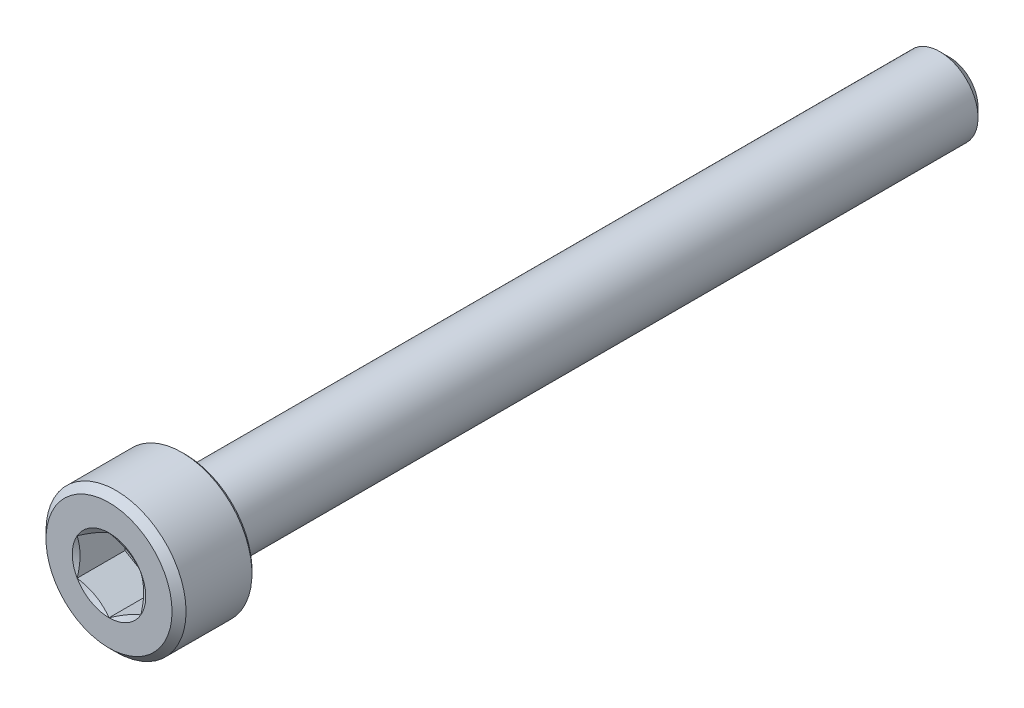
ISO-10303-21;
HEADER;
FILE_DESCRIPTION(('STEP AP214'),'2;1');
FILE_NAME('part.step','',(''),(''),'','','');
FILE_SCHEMA(('AUTOMOTIVE_DESIGN { 1 0 10303 214 1 1 1 1 }'));
ENDSEC;
DATA;
#1=APPLICATION_CONTEXT('core data for automotive mechanical design processes');
#2=APPLICATION_PROTOCOL_DEFINITION('international standard','automotive_design',2000,#1);
#3=PRODUCT_CONTEXT('',#1,'mechanical');
#4=PRODUCT('Part','Part','',(#3));
#5=PRODUCT_RELATED_PRODUCT_CATEGORY('part','',(#4));
#6=PRODUCT_DEFINITION_FORMATION('','',#4);
#7=PRODUCT_DEFINITION_CONTEXT('part definition',#1,'design');
#8=PRODUCT_DEFINITION('design','',#6,#7);
#9=PRODUCT_DEFINITION_SHAPE('','',#8);
#10=(LENGTH_UNIT() NAMED_UNIT(*) SI_UNIT(.MILLI.,.METRE.));
#11=(NAMED_UNIT(*) PLANE_ANGLE_UNIT() SI_UNIT($,.RADIAN.));
#12=(NAMED_UNIT(*) SI_UNIT($,.STERADIAN.) SOLID_ANGLE_UNIT());
#13=UNCERTAINTY_MEASURE_WITH_UNIT(LENGTH_MEASURE(1.E-05),#10,'distance_accuracy_value','');
#14=(GEOMETRIC_REPRESENTATION_CONTEXT(3) GLOBAL_UNCERTAINTY_ASSIGNED_CONTEXT((#13)) GLOBAL_UNIT_ASSIGNED_CONTEXT((#10,
#11,#12)) REPRESENTATION_CONTEXT('',''));
#15=CARTESIAN_POINT('',(0.,0.,0.));
#16=DIRECTION('',(0.,0.,1.));
#17=DIRECTION('',(1.,0.,0.));
#18=AXIS2_PLACEMENT_3D('',#15,#16,#17);
#19=CARTESIAN_POINT('',(-2.6125,0.,13.5));
#20=DIRECTION('',(0.,0.,-1.));
#21=DIRECTION('',(-1.,0.,0.));
#22=AXIS2_PLACEMENT_3D('',#19,#20,#21);
#23=PLANE('',#22);
#24=CARTESIAN_POINT('',(0.,0.,13.5));
#25=DIRECTION('',(0.,0.,-1.));
#26=DIRECTION('',(-1.,0.,0.));
#27=AXIS2_PLACEMENT_3D('',#24,#25,#26);
#28=CIRCLE('',#27,1.5);
#29=CARTESIAN_POINT('',(-1.5,0.,13.5));
#30=VERTEX_POINT('',#29);
#31=EDGE_CURVE('E12',#30,#30,#28,.T.);
#32=ORIENTED_EDGE('',*,*,#31,.F.);
#33=EDGE_LOOP('',(#32));
#34=FACE_BOUND('',#33,.T.);
#35=CARTESIAN_POINT('',(0.,0.,13.5));
#36=DIRECTION('',(0.,0.,-1.));
#37=DIRECTION('',(-1.,0.,0.));
#38=AXIS2_PLACEMENT_3D('',#35,#36,#37);
#39=CIRCLE('',#38,2.6125);
#40=CARTESIAN_POINT('',(-2.6125,0.,13.5));
#41=VERTEX_POINT('',#40);
#42=EDGE_CURVE('E260',#41,#41,#39,.T.);
#43=ORIENTED_EDGE('',*,*,#42,.T.);
#44=EDGE_LOOP('',(#43));
#45=FACE_BOUND('',#44,.T.);
#46=ADVANCED_FACE('F42',(#34,#45),#23,.T.);
#47=CARTESIAN_POINT('',(0.,0.,14.625));
#48=DIRECTION('',(0.,0.,1.));
#49=DIRECTION('',(1.,0.,0.));
#50=AXIS2_PLACEMENT_3D('',#47,#48,#49);
#51=PLANE('',#50);
#52=DIRECTION('',(-0.866025403784439,0.5,0.));
#53=VECTOR('',#52,1.);
#54=CARTESIAN_POINT('',(1.25,0.721687836487031,14.625));
#55=LINE('',#54,#53);
#56=CARTESIAN_POINT('',(1.25,0.721687836487031,14.625));
#57=VERTEX_POINT('',#56);
#58=CARTESIAN_POINT('',(0.,1.44337567297406,14.625));
#59=VERTEX_POINT('',#58);
#60=EDGE_CURVE('E108',#57,#59,#55,.T.);
#61=ORIENTED_EDGE('',*,*,#60,.T.);
#62=DIRECTION('',(-0.866025403784438,-0.5,0.));
#63=VECTOR('',#62,1.);
#64=CARTESIAN_POINT('',(0.,1.44337567297406,14.625));
#65=LINE('',#64,#63);
#66=CARTESIAN_POINT('',(-1.25,0.72168783648703,14.625));
#67=VERTEX_POINT('',#66);
#68=EDGE_CURVE('E227',#59,#67,#65,.T.);
#69=ORIENTED_EDGE('',*,*,#68,.T.);
#70=DIRECTION('',(0.,-1.,0.));
#71=VECTOR('',#70,1.);
#72=CARTESIAN_POINT('',(-1.25,0.72168783648703,14.625));
#73=LINE('',#72,#71);
#74=CARTESIAN_POINT('',(-1.25,-0.721687836487034,14.625));
#75=VERTEX_POINT('',#74);
#76=EDGE_CURVE('E230',#67,#75,#73,.T.);
#77=ORIENTED_EDGE('',*,*,#76,.T.);
#78=DIRECTION('',(0.866025403784439,-0.5,0.));
#79=VECTOR('',#78,1.);
#80=CARTESIAN_POINT('',(-1.25,-0.721687836487034,14.625));
#81=LINE('',#80,#79);
#82=CARTESIAN_POINT('',(0.,-1.44337567297407,14.625));
#83=VERTEX_POINT('',#82);
#84=EDGE_CURVE('E231',#75,#83,#81,.T.);
#85=ORIENTED_EDGE('',*,*,#84,.T.);
#86=DIRECTION('',(0.866025403784439,0.5,0.));
#87=VECTOR('',#86,1.);
#88=CARTESIAN_POINT('',(0.,-1.44337567297407,14.625));
#89=LINE('',#88,#87);
#90=CARTESIAN_POINT('',(1.25,-0.721687836487034,14.625));
#91=VERTEX_POINT('',#90);
#92=EDGE_CURVE('E236',#83,#91,#89,.T.);
#93=ORIENTED_EDGE('',*,*,#92,.T.);
#94=DIRECTION('',(0.,1.,0.));
#95=VECTOR('',#94,1.);
#96=CARTESIAN_POINT('',(1.25,-0.721687836487034,14.625));
#97=LINE('',#96,#95);
#98=EDGE_CURVE('E229',#91,#57,#97,.T.);
#99=ORIENTED_EDGE('',*,*,#98,.T.);
#100=EDGE_LOOP('',(#61,#69,#77,#85,#93,#99));
#101=FACE_BOUND('',#100,.T.);
#102=ADVANCED_FACE('F216',(#101),#51,.T.);
#103=CARTESIAN_POINT('',(0.,1.44337567297406,14.625));
#104=DIRECTION('',(-0.5,0.866025403784438,0.));
#105=DIRECTION('',(-0.866025403784439,-0.5,0.));
#106=AXIS2_PLACEMENT_3D('',#103,#104,#105);
#107=PLANE('',#106);
#108=DIRECTION('',(0.,0.,1.));
#109=VECTOR('',#108,1.);
#110=CARTESIAN_POINT('',(0.,1.44337567297406,14.625));
#111=LINE('',#110,#109);
#112=CARTESIAN_POINT('',(0.,1.44337567297406,16.5));
#113=VERTEX_POINT('',#112);
#114=EDGE_CURVE('E64',#59,#113,#111,.T.);
#115=ORIENTED_EDGE('',*,*,#114,.T.);
#116=CARTESIAN_POINT('',(0.000199999999999545,1.4434911430279,16.500066674666));
#117=CARTESIAN_POINT('',(-0.0547333052317655,1.41177538446486,16.4817459147637));
#118=CARTESIAN_POINT('',(-0.11014078650024,1.37978586023939,16.4650833062006));
#119=CARTESIAN_POINT('',(-0.22191536760034,1.31525277575269,16.4359973039458));
#120=CARTESIAN_POINT('',(-0.278284454841711,1.28270806805991,16.4235842019761));
#121=CARTESIAN_POINT('',(-0.390323974086985,1.21802202146378,16.404259687636));
#122=CARTESIAN_POINT('',(-0.44597715845923,1.1858906404852,16.3972196894474));
#123=CARTESIAN_POINT('',(-0.557545653908392,1.12147653960455,16.3888124326306));
#124=CARTESIAN_POINT('',(-0.613460558937601,1.08919405413422,16.3874382152047));
#125=CARTESIAN_POINT('',(-0.717957921181725,1.02886247391297,16.3902833373679));
#126=CARTESIAN_POINT('',(-0.766555949881316,1.00080438896118,16.39380409882));
#127=CARTESIAN_POINT('',(-0.863435362173239,0.944871034195501,16.4049671126993));
#128=CARTESIAN_POINT('',(-0.911716410192164,0.916995958125017,16.4126131855727));
#129=CARTESIAN_POINT('',(-1.00879588385404,0.860947097873544,16.4317294547005));
#130=CARTESIAN_POINT('',(-1.0575820103519,0.832780414607287,16.4432807569797));
#131=CARTESIAN_POINT('',(-1.1544262522921,0.776867365453646,16.4694983146939));
#132=CARTESIAN_POINT('',(-1.20248561032696,0.749120282155138,16.4841584021391));
#133=CARTESIAN_POINT('',(-1.2502,0.721572366433192,16.500066674666));
#134=B_SPLINE_CURVE_WITH_KNOTS('',3,(#116,#117,#118,#119,#120,#121,#122,#123,#124,#125,#126,
#127,#128,#129,#130,#131,#132,#133),.UNSPECIFIED.,.F.,.F.,(4,2,2,2,2,2,2,2,4),(0.,
0.198150821029559,0.396778196315221,0.5904886173544,0.783961049317182,0.952480056398646,
1.1211553973001,1.2935743034359,1.4656542697693),.UNSPECIFIED.);
#135=CARTESIAN_POINT('',(-1.25,0.721687836487032,16.5));
#136=VERTEX_POINT('',#135);
#137=EDGE_CURVE('E121',#113,#136,#134,.T.);
#138=ORIENTED_EDGE('',*,*,#137,.T.);
#139=DIRECTION('',(0.,0.,1.));
#140=VECTOR('',#139,1.);
#141=CARTESIAN_POINT('',(-1.25,0.72168783648703,14.625));
#142=LINE('',#141,#140);
#143=EDGE_CURVE('E245',#67,#136,#142,.T.);
#144=ORIENTED_EDGE('',*,*,#143,.F.);
#145=ORIENTED_EDGE('',*,*,#68,.F.);
#146=EDGE_LOOP('',(#115,#138,#144,#145));
#147=FACE_BOUND('',#146,.T.);
#148=ADVANCED_FACE('F155',(#147),#107,.F.);
#149=CARTESIAN_POINT('',(-1.25,0.72168783648703,14.625));
#150=DIRECTION('',(-1.,0.,0.));
#151=DIRECTION('',(0.,-1.,0.));
#152=AXIS2_PLACEMENT_3D('',#149,#150,#151);
#153=PLANE('',#152);
#154=ORIENTED_EDGE('',*,*,#143,.T.);
#155=CARTESIAN_POINT('',(-1.25,-1.86893140179217,16.9647941109243));
#156=CARTESIAN_POINT('',(-1.25,-1.81495202267025,16.9388968384665));
#157=CARTESIAN_POINT('',(-1.25,-1.76084125344196,16.9132686219312));
#158=CARTESIAN_POINT('',(-1.25,-1.65228662652066,16.8627027606134));
#159=CARTESIAN_POINT('',(-1.25,-1.59784271100767,16.8377652401103));
#160=CARTESIAN_POINT('',(-1.25,-1.48823931692675,16.7885939163498));
#161=CARTESIAN_POINT('',(-1.25,-1.43307750108907,16.7643652994868));
#162=CARTESIAN_POINT('',(-1.25,-1.32229188443621,16.7169950705039));
#163=CARTESIAN_POINT('',(-1.25,-1.26666810781962,16.6938534018645));
#164=CARTESIAN_POINT('',(-1.25,-1.15340083047608,16.6483546130678));
#165=CARTESIAN_POINT('',(-1.25,-1.09574254265115,16.6260338154653));
#166=CARTESIAN_POINT('',(-1.25,-0.979741082890175,16.583255476912));
#167=CARTESIAN_POINT('',(-1.25,-0.921397826164638,16.5627981694397));
#168=CARTESIAN_POINT('',(-1.25,-0.745435524772241,16.5050842376762));
#169=CARTESIAN_POINT('',(-1.25,-0.62656193813286,16.4713502149769));
#170=CARTESIAN_POINT('',(-1.25,-0.445873083681239,16.4322204068282));
#171=CARTESIAN_POINT('',(-1.25,-0.385304700192768,16.4210940606189));
#172=CARTESIAN_POINT('',(-1.25,-0.26348659206503,16.4034278522676));
#173=CARTESIAN_POINT('',(-1.25,-0.202236913753247,16.3968876801832));
#174=CARTESIAN_POINT('',(-1.25,-0.0801324468775848,16.3889987810428));
#175=CARTESIAN_POINT('',(-1.25,-0.0192817197887167,16.3875887912582));
#176=CARTESIAN_POINT('',(-1.25,0.102319232701152,16.3899161878862));
#177=CARTESIAN_POINT('',(-1.25,0.163069451645859,16.393653893026));
#178=CARTESIAN_POINT('',(-1.25,0.312961598922923,16.4088980280361));
#179=CARTESIAN_POINT('',(-1.25,0.401813055628259,16.4232612484297));
#180=CARTESIAN_POINT('',(-1.25,0.577788146583197,16.4602998495149));
#181=CARTESIAN_POINT('',(-1.25,0.664909564430747,16.4829852483541));
#182=CARTESIAN_POINT('',(-1.25,0.795209224728791,16.5217374532821));
#183=CARTESIAN_POINT('',(-1.25,0.839061001813533,16.5356229448103));
#184=CARTESIAN_POINT('',(-1.25,0.926308087473953,16.5646784153621));
#185=CARTESIAN_POINT('',(-1.25,0.969703662172459,16.5798475927664));
#186=CARTESIAN_POINT('',(-1.25,1.05609633508794,16.6112501339966));
#187=CARTESIAN_POINT('',(-1.25,1.09909350410933,16.627483304423));
#188=CARTESIAN_POINT('',(-1.25,1.18474903910479,16.6608382439108));
#189=CARTESIAN_POINT('',(-1.25,1.22740734642399,16.6779601631043));
#190=CARTESIAN_POINT('',(-1.25,1.33629459550825,16.7227614292321));
#191=CARTESIAN_POINT('',(-1.25,1.40230581092028,16.7509693835735));
#192=CARTESIAN_POINT('',(-1.25,1.53373213594212,16.8087450811585));
#193=CARTESIAN_POINT('',(-1.25,1.59914720045374,16.8383129262699));
#194=CARTESIAN_POINT('',(-1.25,1.79469680395942,16.9285769200244));
#195=CARTESIAN_POINT('',(-1.25,1.92411390982368,16.9908242731852));
#196=CARTESIAN_POINT('',(-1.25,2.18184246876936,17.1179296229027));
#197=CARTESIAN_POINT('',(-1.25,2.31015236703661,17.182790734765));
#198=CARTESIAN_POINT('',(-1.25,2.56589305685455,17.3141807455314));
#199=CARTESIAN_POINT('',(-1.25,2.69332395754888,17.3807094324427));
#200=CARTESIAN_POINT('',(-1.25,2.93557826301822,17.5085820016458));
#201=CARTESIAN_POINT('',(-1.25,3.05045639113076,17.5698225704122));
#202=CARTESIAN_POINT('',(-1.25,3.27984311898855,17.6930014800409));
#203=CARTESIAN_POINT('',(-1.25,3.39435170485538,17.7549398467261));
#204=CARTESIAN_POINT('',(-1.25,3.62279327872168,17.8791811560561));
#205=CARTESIAN_POINT('',(-1.25,3.73672698995313,17.941482770676));
#206=CARTESIAN_POINT('',(-1.25,3.96436406629495,18.0664914919315));
#207=CARTESIAN_POINT('',(-1.25,4.07806744314788,18.1291985771761));
#208=CARTESIAN_POINT('',(-1.25,4.19168806612954,18.1920543493623));
#209=B_SPLINE_CURVE_WITH_KNOTS('',3,(#155,#156,#157,#158,#159,#160,#161,#162,#163,#164,#165,
#166,#167,#168,#169,#170,#171,#172,#173,#174,#175,#176,#177,#178,#179,#180,#181,#182,#183,#184,
#185,#186,#187,#188,#189,#190,#191,#192,#193,#194,#195,#196,#197,#198,#199,#200,#201,#202,#203,
#204,#205,#206,#207,#208),.UNSPECIFIED.,.F.,.F.,(4,2,2,2,2,2,2,2,2,2,2,2,2,2,2,2,2,2,2,2,2,2,2,
2,2,2,4),(0.,0.179612926712514,0.359257964580623,0.539992735616907,0.720718098311213,
0.906167781883877,1.09164066876278,1.4615401462125,1.64614554413147,1.83073846485712,
2.0131196740194,2.19551217609307,2.46497297688035,2.73475922178117,2.87273702323329,
3.01062928909397,3.14849655975686,3.28638719597089,3.50172172546908,3.7170724117864,
4.14784491349865,4.57914698286382,5.01039449766869,5.40093821140478,5.79149642546539,
6.18106124184771,6.57060567131893),.UNSPECIFIED.);
#210=CARTESIAN_POINT('',(-1.25,-0.721687836487033,16.5));
#211=VERTEX_POINT('',#210);
#212=EDGE_CURVE('E128',#136,#211,#209,.F.);
#213=ORIENTED_EDGE('',*,*,#212,.T.);
#214=DIRECTION('',(0.,0.,1.));
#215=VECTOR('',#214,1.);
#216=CARTESIAN_POINT('',(-1.25,-0.721687836487034,14.625));
#217=LINE('',#216,#215);
#218=EDGE_CURVE('E243',#75,#211,#217,.T.);
#219=ORIENTED_EDGE('',*,*,#218,.F.);
#220=ORIENTED_EDGE('',*,*,#76,.F.);
#221=EDGE_LOOP('',(#154,#213,#219,#220));
#222=FACE_BOUND('',#221,.T.);
#223=ADVANCED_FACE('F150',(#222),#153,.F.);
#224=CARTESIAN_POINT('',(-1.25,-0.721687836487034,14.625));
#225=DIRECTION('',(-0.5,-0.866025403784439,0.));
#226=DIRECTION('',(0.866025403784439,-0.5,0.));
#227=AXIS2_PLACEMENT_3D('',#224,#225,#226);
#228=PLANE('',#227);
#229=ORIENTED_EDGE('',*,*,#218,.T.);
#230=CARTESIAN_POINT('',(-1.2502,-0.721572366433196,16.500066674666));
#231=CARTESIAN_POINT('',(-1.19526669476823,-0.753288124996232,16.4817459147637));
#232=CARTESIAN_POINT('',(-1.13985921349976,-0.785277649221705,16.4650833062006));
#233=CARTESIAN_POINT('',(-1.02808463239966,-0.849810733708405,16.4359973039458));
#234=CARTESIAN_POINT('',(-0.971715545158289,-0.882355441401184,16.423584201976));
#235=CARTESIAN_POINT('',(-0.859676025913015,-0.947041487997319,16.404259687636));
#236=CARTESIAN_POINT('',(-0.80402284154077,-0.979172868975895,16.3972196894474));
#237=CARTESIAN_POINT('',(-0.692454346091608,-1.04358696985655,16.3888124326306));
#238=CARTESIAN_POINT('',(-0.636539441062399,-1.07586945532688,16.3874382152047));
#239=CARTESIAN_POINT('',(-0.532042078818274,-1.13620103554813,16.3902833373679));
#240=CARTESIAN_POINT('',(-0.483444050118683,-1.16425912049992,16.39380409882));
#241=CARTESIAN_POINT('',(-0.38656463782676,-1.2201924752656,16.4049671126993));
#242=CARTESIAN_POINT('',(-0.338283589807835,-1.24806755133608,16.4126131855727));
#243=CARTESIAN_POINT('',(-0.241204116145956,-1.30411641158755,16.4317294547005));
#244=CARTESIAN_POINT('',(-0.192417989648099,-1.33228309485381,16.4432807569797));
#245=CARTESIAN_POINT('',(-0.0955737477078969,-1.38819614400745,16.4694983146939));
#246=CARTESIAN_POINT('',(-0.0475143896730349,-1.41594322730596,16.4841584021391));
#247=CARTESIAN_POINT('',(0.000200000000000781,-1.4434911430279,16.500066674666));
#248=B_SPLINE_CURVE_WITH_KNOTS('',3,(#230,#231,#232,#233,#234,#235,#236,#237,#238,#239,#240,
#241,#242,#243,#244,#245,#246,#247),.UNSPECIFIED.,.F.,.F.,(4,2,2,2,2,2,2,2,4),(0.,
0.19815082102956,0.396778196315222,0.590488617354401,0.783961049317183,0.952480056398648,
1.1211553973001,1.2935743034359,1.4656542697693),.UNSPECIFIED.);
#249=CARTESIAN_POINT('',(0.,-1.44337567297407,16.5));
#250=VERTEX_POINT('',#249);
#251=EDGE_CURVE('E131',#211,#250,#248,.T.);
#252=ORIENTED_EDGE('',*,*,#251,.T.);
#253=DIRECTION('',(0.,0.,1.));
#254=VECTOR('',#253,1.);
#255=CARTESIAN_POINT('',(0.,-1.44337567297407,14.625));
#256=LINE('',#255,#254);
#257=EDGE_CURVE('E240',#83,#250,#256,.T.);
#258=ORIENTED_EDGE('',*,*,#257,.F.);
#259=ORIENTED_EDGE('',*,*,#84,.F.);
#260=EDGE_LOOP('',(#229,#252,#258,#259));
#261=FACE_BOUND('',#260,.T.);
#262=ADVANCED_FACE('F154',(#261),#228,.F.);
#263=CARTESIAN_POINT('',(0.,-1.44337567297407,14.625));
#264=DIRECTION('',(0.5,-0.866025403784439,0.));
#265=DIRECTION('',(0.866025403784439,0.5,0.));
#266=AXIS2_PLACEMENT_3D('',#263,#264,#265);
#267=PLANE('',#266);
#268=ORIENTED_EDGE('',*,*,#257,.T.);
#269=CARTESIAN_POINT('',(-0.000199999999999969,-1.4434911430279,16.500066674666));
#270=CARTESIAN_POINT('',(0.0547333052317653,-1.41177538446487,16.4817459147637));
#271=CARTESIAN_POINT('',(0.11014078650024,-1.3797858602394,16.4650833062006));
#272=CARTESIAN_POINT('',(0.221915367600341,-1.31525277575269,16.4359973039458));
#273=CARTESIAN_POINT('',(0.278284454841711,-1.28270806805992,16.423584201976));
#274=CARTESIAN_POINT('',(0.390323974086985,-1.21802202146378,16.404259687636));
#275=CARTESIAN_POINT('',(0.445977158459231,-1.1858906404852,16.3972196894474));
#276=CARTESIAN_POINT('',(0.557545653908393,-1.12147653960455,16.3888124326306));
#277=CARTESIAN_POINT('',(0.613460558937601,-1.08919405413422,16.3874382152047));
#278=CARTESIAN_POINT('',(0.717957921181726,-1.02886247391297,16.3902833373679));
#279=CARTESIAN_POINT('',(0.766555949881316,-1.00080438896118,16.39380409882));
#280=CARTESIAN_POINT('',(0.863435362173238,-0.944871034195505,16.4049671126993));
#281=CARTESIAN_POINT('',(0.911716410192163,-0.916995958125022,16.4126131855727));
#282=CARTESIAN_POINT('',(1.00879588385404,-0.860947097873548,16.4317294547005));
#283=CARTESIAN_POINT('',(1.0575820103519,-0.832780414607291,16.4432807569797));
#284=CARTESIAN_POINT('',(1.1544262522921,-0.77686736545365,16.4694983146939));
#285=CARTESIAN_POINT('',(1.20248561032696,-0.749120282155142,16.4841584021391));
#286=CARTESIAN_POINT('',(1.2502,-0.721572366433196,16.500066674666));
#287=B_SPLINE_CURVE_WITH_KNOTS('',3,(#269,#270,#271,#272,#273,#274,#275,#276,#277,#278,#279,
#280,#281,#282,#283,#284,#285,#286),.UNSPECIFIED.,.F.,.F.,(4,2,2,2,2,2,2,2,4),(0.,
0.198150821029561,0.396778196315223,0.590488617354401,0.783961049317183,0.952480056398647,
1.1211553973001,1.2935743034359,1.4656542697693),.UNSPECIFIED.);
#288=CARTESIAN_POINT('',(1.25,-0.721687836487034,16.5));
#289=VERTEX_POINT('',#288);
#290=EDGE_CURVE('E116',#250,#289,#287,.T.);
#291=ORIENTED_EDGE('',*,*,#290,.T.);
#292=DIRECTION('',(0.,0.,1.));
#293=VECTOR('',#292,1.);
#294=CARTESIAN_POINT('',(1.25,-0.721687836487034,14.625));
#295=LINE('',#294,#293);
#296=EDGE_CURVE('E114',#91,#289,#295,.T.);
#297=ORIENTED_EDGE('',*,*,#296,.F.);
#298=ORIENTED_EDGE('',*,*,#92,.F.);
#299=EDGE_LOOP('',(#268,#291,#297,#298));
#300=FACE_BOUND('',#299,.T.);
#301=ADVANCED_FACE('F161',(#300),#267,.F.);
#302=CARTESIAN_POINT('',(1.25,-0.721687836487034,14.625));
#303=DIRECTION('',(1.,0.,0.));
#304=DIRECTION('',(0.,0.,-1.));
#305=AXIS2_PLACEMENT_3D('',#302,#303,#304);
#306=PLANE('',#305);
#307=ORIENTED_EDGE('',*,*,#296,.T.);
#308=CARTESIAN_POINT('',(1.25,-1.86893140179217,16.9647941109243));
#309=CARTESIAN_POINT('',(1.25,-1.81495202267025,16.9388968384665));
#310=CARTESIAN_POINT('',(1.25,-1.76084125344196,16.9132686219312));
#311=CARTESIAN_POINT('',(1.25,-1.65228662652066,16.8627027606134));
#312=CARTESIAN_POINT('',(1.25,-1.59784271100767,16.8377652401103));
#313=CARTESIAN_POINT('',(1.25,-1.48823931692675,16.7885939163498));
#314=CARTESIAN_POINT('',(1.25,-1.43307750108907,16.7643652994868));
#315=CARTESIAN_POINT('',(1.25,-1.32229188443621,16.7169950705039));
#316=CARTESIAN_POINT('',(1.25,-1.26666810781962,16.6938534018645));
#317=CARTESIAN_POINT('',(1.25,-1.15340083047608,16.6483546130678));
#318=CARTESIAN_POINT('',(1.25,-1.09574254265115,16.6260338154653));
#319=CARTESIAN_POINT('',(1.25,-0.979741082890175,16.583255476912));
#320=CARTESIAN_POINT('',(1.25,-0.921397826164639,16.5627981694397));
#321=CARTESIAN_POINT('',(1.25,-0.745435524772241,16.5050842376762));
#322=CARTESIAN_POINT('',(1.25,-0.626561938132861,16.4713502149769));
#323=CARTESIAN_POINT('',(1.25,-0.445873083681239,16.4322204068282));
#324=CARTESIAN_POINT('',(1.25,-0.385304700192768,16.4210940606189));
#325=CARTESIAN_POINT('',(1.25,-0.26348659206503,16.4034278522676));
#326=CARTESIAN_POINT('',(1.25,-0.202236913753247,16.3968876801832));
#327=CARTESIAN_POINT('',(1.25,-0.0801324468775847,16.3889987810428));
#328=CARTESIAN_POINT('',(1.25,-0.0192817197887163,16.3875887912582));
#329=CARTESIAN_POINT('',(1.25,0.102319232701152,16.3899161878862));
#330=CARTESIAN_POINT('',(1.25,0.16306945164586,16.393653893026));
#331=CARTESIAN_POINT('',(1.25,0.312961598922924,16.4088980280361));
#332=CARTESIAN_POINT('',(1.25,0.40181305562826,16.4232612484297));
#333=CARTESIAN_POINT('',(1.25,0.577788146583198,16.4602998495149));
#334=CARTESIAN_POINT('',(1.25,0.664909564430748,16.4829852483541));
#335=CARTESIAN_POINT('',(1.25,0.795209224728792,16.5217374532821));
#336=CARTESIAN_POINT('',(1.25,0.839061001813534,16.5356229448103));
#337=CARTESIAN_POINT('',(1.25,0.926308087473953,16.5646784153621));
#338=CARTESIAN_POINT('',(1.25,0.96970366217246,16.5798475927664));
#339=CARTESIAN_POINT('',(1.25,1.05609633508794,16.6112501339966));
#340=CARTESIAN_POINT('',(1.25,1.09909350410933,16.627483304423));
#341=CARTESIAN_POINT('',(1.25,1.1847490391048,16.6608382439108));
#342=CARTESIAN_POINT('',(1.25,1.22740734642399,16.6779601631043));
#343=CARTESIAN_POINT('',(1.25,1.33629459550825,16.7227614292321));
#344=CARTESIAN_POINT('',(1.25,1.40230581092028,16.7509693835735));
#345=CARTESIAN_POINT('',(1.25,1.53373213594212,16.8087450811585));
#346=CARTESIAN_POINT('',(1.25,1.59914720045375,16.8383129262699));
#347=CARTESIAN_POINT('',(1.25,1.79469680395943,16.9285769200244));
#348=CARTESIAN_POINT('',(1.25,1.92411390982369,16.9908242731852));
#349=CARTESIAN_POINT('',(1.25,2.18184246876936,17.1179296229027));
#350=CARTESIAN_POINT('',(1.25,2.31015236703662,17.182790734765));
#351=CARTESIAN_POINT('',(1.25,2.56589305685455,17.3141807455314));
#352=CARTESIAN_POINT('',(1.25,2.69332395754888,17.3807094324427));
#353=CARTESIAN_POINT('',(1.25,2.93557826301822,17.5085820016458));
#354=CARTESIAN_POINT('',(1.25,3.05045639113076,17.5698225704122));
#355=CARTESIAN_POINT('',(1.25,3.27984311898855,17.6930014800409));
#356=CARTESIAN_POINT('',(1.25,3.39435170485539,17.7549398467262));
#357=CARTESIAN_POINT('',(1.25,3.62279327872168,17.8791811560561));
#358=CARTESIAN_POINT('',(1.25,3.73672698995314,17.941482770676));
#359=CARTESIAN_POINT('',(1.25,3.96436406629495,18.0664914919315));
#360=CARTESIAN_POINT('',(1.25,4.07806744314788,18.1291985771761));
#361=CARTESIAN_POINT('',(1.25,4.19168806612954,18.1920543493623));
#362=B_SPLINE_CURVE_WITH_KNOTS('',3,(#308,#309,#310,#311,#312,#313,#314,#315,#316,#317,#318,
#319,#320,#321,#322,#323,#324,#325,#326,#327,#328,#329,#330,#331,#332,#333,#334,#335,#336,#337,
#338,#339,#340,#341,#342,#343,#344,#345,#346,#347,#348,#349,#350,#351,#352,#353,#354,#355,#356,
#357,#358,#359,#360,#361),.UNSPECIFIED.,.F.,.F.,(4,2,2,2,2,2,2,2,2,2,2,2,2,2,2,2,2,2,2,2,2,2,2,
2,2,2,4),(0.,0.179612926712516,0.359257964580625,0.539992735616909,0.720718098311215,
0.906167781883879,1.09164066876279,1.4615401462125,1.64614554413147,1.83073846485713,
2.01311967401941,2.19551217609307,2.46497297688035,2.73475922178117,2.87273702323329,
3.01062928909398,3.14849655975687,3.28638719597089,3.50172172546909,3.71707241178641,
4.14784491349866,4.57914698286383,5.0103944976687,5.40093821140479,5.7914964254654,
6.18106124184772,6.57060567131893),.UNSPECIFIED.);
#363=CARTESIAN_POINT('',(1.25,0.721687836487028,16.5));
#364=VERTEX_POINT('',#363);
#365=EDGE_CURVE('E100',#289,#364,#362,.T.);
#366=ORIENTED_EDGE('',*,*,#365,.T.);
#367=DIRECTION('',(0.,0.,1.));
#368=VECTOR('',#367,1.);
#369=CARTESIAN_POINT('',(1.25,0.721687836487031,14.625));
#370=LINE('',#369,#368);
#371=EDGE_CURVE('E113',#57,#364,#370,.T.);
#372=ORIENTED_EDGE('',*,*,#371,.F.);
#373=ORIENTED_EDGE('',*,*,#98,.F.);
#374=EDGE_LOOP('',(#307,#366,#372,#373));
#375=FACE_BOUND('',#374,.T.);
#376=ADVANCED_FACE('F111',(#375),#306,.F.);
#377=CARTESIAN_POINT('',(1.25,0.721687836487031,14.625));
#378=DIRECTION('',(0.5,0.866025403784439,0.));
#379=DIRECTION('',(-0.866025403784439,0.5,0.));
#380=AXIS2_PLACEMENT_3D('',#377,#378,#379);
#381=PLANE('',#380);
#382=ORIENTED_EDGE('',*,*,#371,.T.);
#383=CARTESIAN_POINT('',(1.2502,0.721572366433193,16.500066674666));
#384=CARTESIAN_POINT('',(1.19526669476823,0.753288124996229,16.4817459147637));
#385=CARTESIAN_POINT('',(1.13985921349976,0.785277649221701,16.4650833062006));
#386=CARTESIAN_POINT('',(1.02808463239966,0.849810733708402,16.4359973039458));
#387=CARTESIAN_POINT('',(0.97171554515829,0.88235544140118,16.4235842019761));
#388=CARTESIAN_POINT('',(0.859676025913015,0.947041487997316,16.404259687636));
#389=CARTESIAN_POINT('',(0.80402284154077,0.979172868975891,16.3972196894474));
#390=CARTESIAN_POINT('',(0.692454346091608,1.04358696985655,16.3888124326306));
#391=CARTESIAN_POINT('',(0.636539441062399,1.07586945532687,16.3874382152047));
#392=CARTESIAN_POINT('',(0.532042078818274,1.13620103554812,16.3902833373679));
#393=CARTESIAN_POINT('',(0.483444050118684,1.16425912049992,16.39380409882));
#394=CARTESIAN_POINT('',(0.386564637826761,1.22019247526559,16.4049671126993));
#395=CARTESIAN_POINT('',(0.338283589807836,1.24806755133608,16.4126131855727));
#396=CARTESIAN_POINT('',(0.241204116145956,1.30411641158755,16.4317294547005));
#397=CARTESIAN_POINT('',(0.1924179896481,1.33228309485381,16.4432807569797));
#398=CARTESIAN_POINT('',(0.0955737477078973,1.38819614400745,16.4694983146939));
#399=CARTESIAN_POINT('',(0.0475143896730352,1.41594322730595,16.4841584021391));
#400=CARTESIAN_POINT('',(-0.00020000000000046,1.4434911430279,16.500066674666));
#401=B_SPLINE_CURVE_WITH_KNOTS('',3,(#383,#384,#385,#386,#387,#388,#389,#390,#391,#392,#393,
#394,#395,#396,#397,#398,#399,#400),.UNSPECIFIED.,.F.,.F.,(4,2,2,2,2,2,2,2,4),(0.,
0.198150821029558,0.39677819631522,0.5904886173544,0.783961049317182,0.952480056398647,
1.1211553973001,1.2935743034359,1.4656542697693),.UNSPECIFIED.);
#402=EDGE_CURVE('E105',#364,#113,#401,.T.);
#403=ORIENTED_EDGE('',*,*,#402,.T.);
#404=ORIENTED_EDGE('',*,*,#114,.F.);
#405=ORIENTED_EDGE('',*,*,#60,.F.);
#406=EDGE_LOOP('',(#382,#403,#404,#405));
#407=FACE_BOUND('',#406,.T.);
#408=ADVANCED_FACE('F118',(#407),#381,.F.);
#409=CARTESIAN_POINT('',(0.,0.,16.5));
#410=DIRECTION('',(0.,0.,1.));
#411=DIRECTION('',(1.,0.,0.));
#412=AXIS2_PLACEMENT_3D('',#409,#410,#411);
#413=CONICAL_SURFACE('',#412,1.44337567297406,1.0471975511966);
#414=CARTESIAN_POINT('',(0.,0.,16.5));
#415=DIRECTION('',(0.,0.,1.));
#416=DIRECTION('',(1.,0.,0.));
#417=AXIS2_PLACEMENT_3D('',#414,#415,#416);
#418=CIRCLE('',#417,1.44337567297406);
#419=EDGE_CURVE('E127',#113,#136,#418,.T.);
#420=ORIENTED_EDGE('',*,*,#419,.T.);
#421=ORIENTED_EDGE('',*,*,#137,.F.);
#422=EDGE_LOOP('',(#420,#421));
#423=FACE_BOUND('',#422,.T.);
#424=ADVANCED_FACE('F185',(#423),#413,.F.);
#425=EDGE_CURVE('E129',#136,#211,#418,.T.);
#426=ORIENTED_EDGE('',*,*,#425,.T.);
#427=ORIENTED_EDGE('',*,*,#212,.F.);
#428=EDGE_LOOP('',(#426,#427));
#429=FACE_BOUND('',#428,.T.);
#430=ADVANCED_FACE('F296',(#429),#413,.F.);
#431=EDGE_CURVE('E285',#211,#250,#418,.T.);
#432=ORIENTED_EDGE('',*,*,#431,.T.);
#433=ORIENTED_EDGE('',*,*,#251,.F.);
#434=EDGE_LOOP('',(#432,#433));
#435=FACE_BOUND('',#434,.T.);
#436=ADVANCED_FACE('F294',(#435),#413,.F.);
#437=EDGE_CURVE('E104',#250,#289,#418,.T.);
#438=ORIENTED_EDGE('',*,*,#437,.T.);
#439=ORIENTED_EDGE('',*,*,#290,.F.);
#440=EDGE_LOOP('',(#438,#439));
#441=FACE_BOUND('',#440,.T.);
#442=ADVANCED_FACE('F291',(#441),#413,.F.);
#443=EDGE_CURVE('E50',#289,#364,#418,.T.);
#444=ORIENTED_EDGE('',*,*,#443,.T.);
#445=ORIENTED_EDGE('',*,*,#365,.F.);
#446=EDGE_LOOP('',(#444,#445));
#447=FACE_BOUND('',#446,.T.);
#448=ADVANCED_FACE('F98',(#447),#413,.F.);
#449=EDGE_CURVE('E45',#364,#113,#418,.T.);
#450=ORIENTED_EDGE('',*,*,#449,.T.);
#451=ORIENTED_EDGE('',*,*,#402,.F.);
#452=EDGE_LOOP('',(#450,#451));
#453=FACE_BOUND('',#452,.T.);
#454=ADVANCED_FACE('F106',(#453),#413,.F.);
#455=CARTESIAN_POINT('',(0.,2.74999999999999,16.5));
#456=DIRECTION('',(0.,0.,1.));
#457=DIRECTION('',(1.,0.,0.));
#458=AXIS2_PLACEMENT_3D('',#455,#456,#457);
#459=PLANE('',#458);
#460=CARTESIAN_POINT('',(0.,0.,16.5));
#461=DIRECTION('',(0.,0.,1.));
#462=DIRECTION('',(1.,0.,0.));
#463=AXIS2_PLACEMENT_3D('',#460,#461,#462);
#464=CIRCLE('',#463,2.475);
#465=CARTESIAN_POINT('',(2.475,0.,16.5));
#466=VERTEX_POINT('',#465);
#467=EDGE_CURVE('E257',#466,#466,#464,.T.);
#468=ORIENTED_EDGE('',*,*,#467,.T.);
#469=EDGE_LOOP('',(#468));
#470=FACE_BOUND('',#469,.T.);
#471=ORIENTED_EDGE('',*,*,#449,.F.);
#472=ORIENTED_EDGE('',*,*,#443,.F.);
#473=ORIENTED_EDGE('',*,*,#437,.F.);
#474=ORIENTED_EDGE('',*,*,#431,.F.);
#475=ORIENTED_EDGE('',*,*,#425,.F.);
#476=ORIENTED_EDGE('',*,*,#419,.F.);
#477=EDGE_LOOP('',(#471,#472,#473,#474,#475,#476));
#478=FACE_BOUND('',#477,.T.);
#479=ADVANCED_FACE('F124',(#470,#478),#459,.T.);
#480=CARTESIAN_POINT('',(0.,0.,16.225));
#481=DIRECTION('',(0.,0.,-1.));
#482=DIRECTION('',(-1.,0.,0.));
#483=AXIS2_PLACEMENT_3D('',#480,#481,#482);
#484=CONICAL_SURFACE('',#483,2.75,0.785398163397452);
#485=ORIENTED_EDGE('',*,*,#467,.F.);
#486=EDGE_LOOP('',(#485));
#487=FACE_BOUND('',#486,.T.);
#488=CARTESIAN_POINT('',(0.,0.,16.225));
#489=DIRECTION('',(0.,0.,1.));
#490=DIRECTION('',(1.,0.,0.));
#491=AXIS2_PLACEMENT_3D('',#488,#489,#490);
#492=CIRCLE('',#491,2.75);
#493=CARTESIAN_POINT('',(2.75,0.,16.225));
#494=VERTEX_POINT('',#493);
#495=EDGE_CURVE('E254',#494,#494,#492,.F.);
#496=ORIENTED_EDGE('',*,*,#495,.F.);
#497=EDGE_LOOP('',(#496));
#498=FACE_BOUND('',#497,.T.);
#499=ADVANCED_FACE('F190',(#487,#498),#484,.T.);
#500=CARTESIAN_POINT('',(0.,0.,-16.5));
#501=DIRECTION('',(0.,0.,-1.));
#502=DIRECTION('',(-1.,0.,0.));
#503=AXIS2_PLACEMENT_3D('',#500,#501,#502);
#504=CYLINDRICAL_SURFACE('',#503,2.75);
#505=CARTESIAN_POINT('',(0.,0.,13.6375));
#506=DIRECTION('',(0.,0.,-1.));
#507=DIRECTION('',(-1.,0.,0.));
#508=AXIS2_PLACEMENT_3D('',#505,#506,#507);
#509=CIRCLE('',#508,2.75);
#510=CARTESIAN_POINT('',(-2.75,0.,13.6375));
#511=VERTEX_POINT('',#510);
#512=EDGE_CURVE('E263',#511,#511,#509,.F.);
#513=ORIENTED_EDGE('',*,*,#512,.T.);
#514=EDGE_LOOP('',(#513));
#515=FACE_BOUND('',#514,.T.);
#516=ORIENTED_EDGE('',*,*,#495,.T.);
#517=EDGE_LOOP('',(#516));
#518=FACE_BOUND('',#517,.T.);
#519=ADVANCED_FACE('F186',(#515,#518),#504,.T.);
#520=CARTESIAN_POINT('',(0.,0.,13.5));
#521=DIRECTION('',(0.,0.,1.));
#522=DIRECTION('',(1.,0.,0.));
#523=AXIS2_PLACEMENT_3D('',#520,#521,#522);
#524=CONICAL_SURFACE('',#523,2.6125,0.785398163397444);
#525=ORIENTED_EDGE('',*,*,#512,.F.);
#526=EDGE_LOOP('',(#525));
#527=FACE_BOUND('',#526,.T.);
#528=ORIENTED_EDGE('',*,*,#42,.F.);
#529=EDGE_LOOP('',(#528));
#530=FACE_BOUND('',#529,.T.);
#531=ADVANCED_FACE('F189',(#527,#530),#524,.T.);
#532=CARTESIAN_POINT('',(0.,0.,-16.5));
#533=DIRECTION('',(0.,0.,-1.));
#534=DIRECTION('',(-1.,0.,0.));
#535=AXIS2_PLACEMENT_3D('',#532,#533,#534);
#536=CYLINDRICAL_SURFACE('',#535,1.5);
#537=CARTESIAN_POINT('',(0.,0.,-16.125));
#538=DIRECTION('',(0.,0.,-1.));
#539=DIRECTION('',(-1.,0.,0.));
#540=AXIS2_PLACEMENT_3D('',#537,#538,#539);
#541=CIRCLE('',#540,1.5);
#542=CARTESIAN_POINT('',(-1.5,0.,-16.125));
#543=VERTEX_POINT('',#542);
#544=EDGE_CURVE('E269',#543,#543,#541,.T.);
#545=ORIENTED_EDGE('',*,*,#544,.F.);
#546=EDGE_LOOP('',(#545));
#547=FACE_BOUND('',#546,.T.);
#548=ORIENTED_EDGE('',*,*,#31,.T.);
#549=EDGE_LOOP('',(#548));
#550=FACE_BOUND('',#549,.T.);
#551=ADVANCED_FACE('F200',(#547,#550),#536,.T.);
#552=CARTESIAN_POINT('',(0.,0.,-16.125));
#553=DIRECTION('',(0.,0.,1.));
#554=DIRECTION('',(1.,0.,0.));
#555=AXIS2_PLACEMENT_3D('',#552,#553,#554);
#556=CONICAL_SURFACE('',#555,1.5,0.785398163397448);
#557=CARTESIAN_POINT('',(0.,0.,-16.5));
#558=DIRECTION('',(0.,0.,-1.));
#559=DIRECTION('',(-1.,0.,0.));
#560=AXIS2_PLACEMENT_3D('',#557,#558,#559);
#561=CIRCLE('',#560,1.125);
#562=CARTESIAN_POINT('',(-1.125,0.,-16.5));
#563=VERTEX_POINT('',#562);
#564=EDGE_CURVE('E265',#563,#563,#561,.T.);
#565=ORIENTED_EDGE('',*,*,#564,.F.);
#566=EDGE_LOOP('',(#565));
#567=FACE_BOUND('',#566,.T.);
#568=ORIENTED_EDGE('',*,*,#544,.T.);
#569=EDGE_LOOP('',(#568));
#570=FACE_BOUND('',#569,.T.);
#571=ADVANCED_FACE('F204',(#567,#570),#556,.T.);
#572=CARTESIAN_POINT('',(0.,1.49999999999999,-16.5));
#573=DIRECTION('',(0.,0.,-1.));
#574=DIRECTION('',(-1.,0.,0.));
#575=AXIS2_PLACEMENT_3D('',#572,#573,#574);
#576=PLANE('',#575);
#577=ORIENTED_EDGE('',*,*,#564,.T.);
#578=EDGE_LOOP('',(#577));
#579=FACE_BOUND('',#578,.T.);
#580=ADVANCED_FACE('F206',(#579),#576,.T.);
#581=CLOSED_SHELL('',(#46,#102,#148,#223,#262,#301,#376,#408,#424,#430,#436,#442,#448,#454,#479,
#499,#519,#531,#551,#571,#580));
#582=MANIFOLD_SOLID_BREP('B2',#581);
#583=ADVANCED_BREP_SHAPE_REPRESENTATION('',(#18,#582),#14);
#584=SHAPE_DEFINITION_REPRESENTATION(#9,#583);
ENDSEC;
END-ISO-10303-21;
